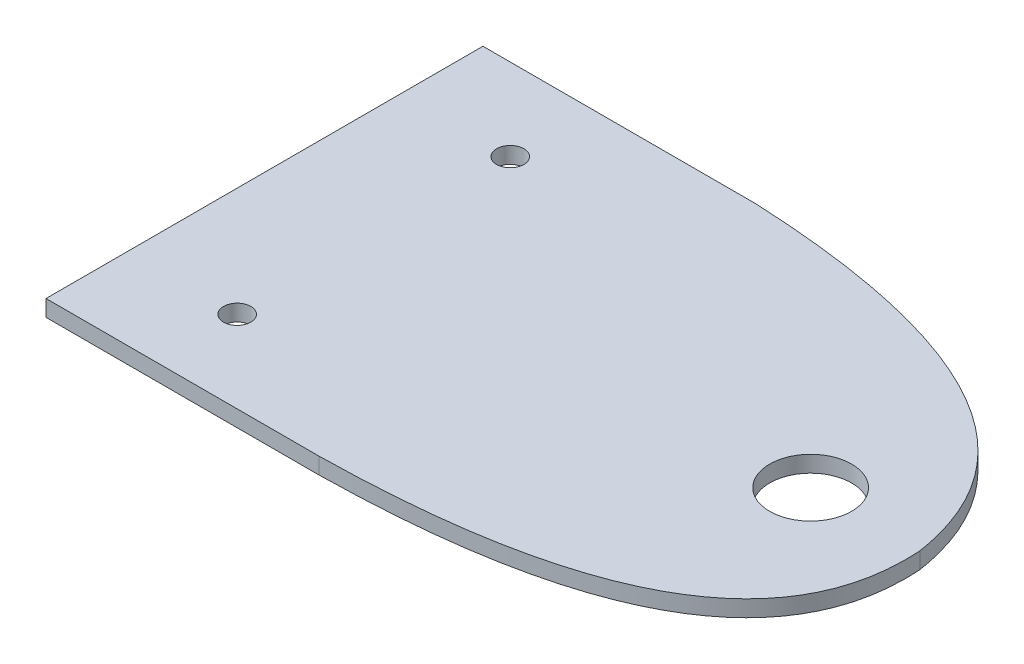
ISO-10303-21;
HEADER;
FILE_DESCRIPTION(('STEP AP214'),'2;1');
FILE_NAME('part.step','',(''),(''),'','','');
FILE_SCHEMA(('AUTOMOTIVE_DESIGN { 1 0 10303 214 1 1 1 1 }'));
ENDSEC;
DATA;
#1=APPLICATION_CONTEXT('core data for automotive mechanical design processes');
#2=APPLICATION_PROTOCOL_DEFINITION('international standard','automotive_design',2000,#1);
#3=PRODUCT_CONTEXT('',#1,'mechanical');
#4=PRODUCT('Part','Part','',(#3));
#5=PRODUCT_RELATED_PRODUCT_CATEGORY('part','',(#4));
#6=PRODUCT_DEFINITION_FORMATION('','',#4);
#7=PRODUCT_DEFINITION_CONTEXT('part definition',#1,'design');
#8=PRODUCT_DEFINITION('design','',#6,#7);
#9=PRODUCT_DEFINITION_SHAPE('','',#8);
#10=(LENGTH_UNIT() NAMED_UNIT(*) SI_UNIT(.MILLI.,.METRE.));
#11=(NAMED_UNIT(*) PLANE_ANGLE_UNIT() SI_UNIT($,.RADIAN.));
#12=(NAMED_UNIT(*) SI_UNIT($,.STERADIAN.) SOLID_ANGLE_UNIT());
#13=UNCERTAINTY_MEASURE_WITH_UNIT(LENGTH_MEASURE(1.E-05),#10,'distance_accuracy_value','');
#14=(GEOMETRIC_REPRESENTATION_CONTEXT(3) GLOBAL_UNCERTAINTY_ASSIGNED_CONTEXT((#13)) GLOBAL_UNIT_ASSIGNED_CONTEXT((#10,
#11,#12)) REPRESENTATION_CONTEXT('',''));
#15=CARTESIAN_POINT('',(0.,0.,0.));
#16=DIRECTION('',(0.,0.,1.));
#17=DIRECTION('',(1.,0.,0.));
#18=AXIS2_PLACEMENT_3D('',#15,#16,#17);
#19=CARTESIAN_POINT('',(0.,3.,40.));
#20=DIRECTION('',(0.,0.,-1.));
#21=DIRECTION('',(-1.,0.,0.));
#22=AXIS2_PLACEMENT_3D('',#19,#20,#21);
#23=PLANE('',#22);
#24=DIRECTION('',(1.,0.,0.));
#25=VECTOR('',#24,1.);
#26=CARTESIAN_POINT('',(0.,0.,40.));
#27=LINE('',#26,#25);
#28=CARTESIAN_POINT('',(-100.,0.,40.));
#29=VERTEX_POINT('',#28);
#30=CARTESIAN_POINT('',(-50.,0.,40.));
#31=VERTEX_POINT('',#30);
#32=EDGE_CURVE('E122',#29,#31,#27,.T.);
#33=ORIENTED_EDGE('',*,*,#32,.T.);
#34=DIRECTION('',(0.,-1.,0.));
#35=VECTOR('',#34,1.);
#36=CARTESIAN_POINT('',(-50.,3.,40.));
#37=LINE('',#36,#35);
#38=CARTESIAN_POINT('',(-50.,3.,40.));
#39=VERTEX_POINT('',#38);
#40=EDGE_CURVE('E11',#39,#31,#37,.T.);
#41=ORIENTED_EDGE('',*,*,#40,.F.);
#42=DIRECTION('',(1.,0.,0.));
#43=VECTOR('',#42,1.);
#44=CARTESIAN_POINT('',(0.,3.,40.));
#45=LINE('',#44,#43);
#46=CARTESIAN_POINT('',(-100.,3.,40.));
#47=VERTEX_POINT('',#46);
#48=EDGE_CURVE('E250',#47,#39,#45,.T.);
#49=ORIENTED_EDGE('',*,*,#48,.F.);
#50=DIRECTION('',(0.,-1.,0.));
#51=VECTOR('',#50,1.);
#52=CARTESIAN_POINT('',(-100.,3.,40.));
#53=LINE('',#52,#51);
#54=EDGE_CURVE('E52',#47,#29,#53,.T.);
#55=ORIENTED_EDGE('',*,*,#54,.T.);
#56=EDGE_LOOP('',(#33,#41,#49,#55));
#57=FACE_BOUND('',#56,.T.);
#58=ADVANCED_FACE('F35',(#57),#23,.F.);
#59=CARTESIAN_POINT('',(-50.,3.,40.));
#60=CARTESIAN_POINT('',(27.117327908936,3.,38.7786956464024));
#61=CARTESIAN_POINT('',(19.3908820577425,3.,-4.89833574009786));
#62=B_SPLINE_CURVE_WITH_KNOTS('',2,(#59,#60,#61),.UNSPECIFIED.,.F.,.F.,(3,3),(0.,1.),.UNSPECIFIED.);
#63=DIRECTION('',(0.,-1.,0.));
#64=VECTOR('',#63,1.);
#65=SURFACE_OF_LINEAR_EXTRUSION('',#62,#64);
#66=CARTESIAN_POINT('',(-50.,0.,40.));
#67=CARTESIAN_POINT('',(27.117327908936,0.,38.7786956464024));
#68=CARTESIAN_POINT('',(19.3908820577425,0.,-4.89833574009786));
#69=B_SPLINE_CURVE_WITH_KNOTS('',2,(#66,#67,#68),.UNSPECIFIED.,.F.,.F.,(3,3),(0.,1.),.UNSPECIFIED.);
#70=CARTESIAN_POINT('',(20.,0.,0.));
#71=VERTEX_POINT('',#70);
#72=EDGE_CURVE('E124',#31,#71,#69,.T.);
#73=ORIENTED_EDGE('',*,*,#72,.T.);
#74=DIRECTION('',(0.,-1.,0.));
#75=VECTOR('',#74,1.);
#76=CARTESIAN_POINT('',(20.,3.,0.));
#77=LINE('',#76,#75);
#78=CARTESIAN_POINT('',(20.,3.,0.));
#79=VERTEX_POINT('',#78);
#80=EDGE_CURVE('E44',#79,#71,#77,.T.);
#81=ORIENTED_EDGE('',*,*,#80,.F.);
#82=EDGE_CURVE('E81',#39,#79,#62,.T.);
#83=ORIENTED_EDGE('',*,*,#82,.F.);
#84=ORIENTED_EDGE('',*,*,#40,.T.);
#85=EDGE_LOOP('',(#73,#81,#83,#84));
#86=FACE_BOUND('',#85,.T.);
#87=ADVANCED_FACE('F145',(#86),#65,.F.);
#88=CARTESIAN_POINT('',(-50.,3.,-40.));
#89=CARTESIAN_POINT('',(14.3898708250912,3.,-37.0556043543383));
#90=CARTESIAN_POINT('',(20.,3.,0.));
#91=B_SPLINE_CURVE_WITH_KNOTS('',2,(#88,#89,#90),.UNSPECIFIED.,.F.,.F.,(3,3),(0.,
0.839710595003454),.UNSPECIFIED.);
#92=DIRECTION('',(0.,-1.,0.));
#93=VECTOR('',#92,1.);
#94=SURFACE_OF_LINEAR_EXTRUSION('',#91,#93);
#95=CARTESIAN_POINT('',(-50.,0.,-40.));
#96=CARTESIAN_POINT('',(14.3898708250912,0.,-37.0556043543383));
#97=CARTESIAN_POINT('',(20.,0.,0.));
#98=B_SPLINE_CURVE_WITH_KNOTS('',2,(#95,#96,#97),.UNSPECIFIED.,.F.,.F.,(3,3),(0.,
0.839710595003454),.UNSPECIFIED.);
#99=CARTESIAN_POINT('',(-50.,0.,-40.));
#100=VERTEX_POINT('',#99);
#101=EDGE_CURVE('E93',#100,#71,#98,.T.);
#102=ORIENTED_EDGE('',*,*,#101,.F.);
#103=DIRECTION('',(0.,-1.,0.));
#104=VECTOR('',#103,1.);
#105=CARTESIAN_POINT('',(-50.,3.,-40.));
#106=LINE('',#105,#104);
#107=CARTESIAN_POINT('',(-50.,3.,-40.));
#108=VERTEX_POINT('',#107);
#109=EDGE_CURVE('E88',#108,#100,#106,.T.);
#110=ORIENTED_EDGE('',*,*,#109,.F.);
#111=EDGE_CURVE('E91',#108,#79,#91,.T.);
#112=ORIENTED_EDGE('',*,*,#111,.T.);
#113=ORIENTED_EDGE('',*,*,#80,.T.);
#114=EDGE_LOOP('',(#102,#110,#112,#113));
#115=FACE_BOUND('',#114,.T.);
#116=ADVANCED_FACE('F90',(#115),#94,.T.);
#117=CARTESIAN_POINT('',(0.,3.,-40.));
#118=DIRECTION('',(0.,0.,-1.));
#119=DIRECTION('',(-1.,0.,0.));
#120=AXIS2_PLACEMENT_3D('',#117,#118,#119);
#121=PLANE('',#120);
#122=DIRECTION('',(1.,0.,0.));
#123=VECTOR('',#122,1.);
#124=CARTESIAN_POINT('',(0.,0.,-40.));
#125=LINE('',#124,#123);
#126=CARTESIAN_POINT('',(-100.,0.,-40.));
#127=VERTEX_POINT('',#126);
#128=EDGE_CURVE('E135',#127,#100,#125,.T.);
#129=ORIENTED_EDGE('',*,*,#128,.F.);
#130=DIRECTION('',(0.,-1.,0.));
#131=VECTOR('',#130,1.);
#132=CARTESIAN_POINT('',(-100.,3.,-40.));
#133=LINE('',#132,#131);
#134=CARTESIAN_POINT('',(-100.,3.,-40.));
#135=VERTEX_POINT('',#134);
#136=EDGE_CURVE('E69',#135,#127,#133,.T.);
#137=ORIENTED_EDGE('',*,*,#136,.F.);
#138=DIRECTION('',(1.,0.,0.));
#139=VECTOR('',#138,1.);
#140=CARTESIAN_POINT('',(0.,3.,-40.));
#141=LINE('',#140,#139);
#142=EDGE_CURVE('E102',#135,#108,#141,.T.);
#143=ORIENTED_EDGE('',*,*,#142,.T.);
#144=ORIENTED_EDGE('',*,*,#109,.T.);
#145=EDGE_LOOP('',(#129,#137,#143,#144));
#146=FACE_BOUND('',#145,.T.);
#147=ADVANCED_FACE('F104',(#146),#121,.T.);
#148=CARTESIAN_POINT('',(-80.,3.,25.));
#149=DIRECTION('',(0.,-1.,0.));
#150=DIRECTION('',(0.,0.,-1.));
#151=AXIS2_PLACEMENT_3D('',#148,#149,#150);
#152=CYLINDRICAL_SURFACE('',#151,2.50000000000001);
#153=CARTESIAN_POINT('',(-80.,3.,25.));
#154=DIRECTION('',(0.,1.,0.));
#155=DIRECTION('',(0.,0.,1.));
#156=AXIS2_PLACEMENT_3D('',#153,#154,#155);
#157=CIRCLE('',#156,2.50000000000001);
#158=CARTESIAN_POINT('',(-80.,3.,27.5));
#159=VERTEX_POINT('',#158);
#160=EDGE_CURVE('E247',#159,#159,#157,.T.);
#161=ORIENTED_EDGE('',*,*,#160,.T.);
#162=EDGE_LOOP('',(#161));
#163=FACE_BOUND('',#162,.T.);
#164=CARTESIAN_POINT('',(-80.,0.,25.));
#165=DIRECTION('',(0.,1.,0.));
#166=DIRECTION('',(0.,0.,1.));
#167=AXIS2_PLACEMENT_3D('',#164,#165,#166);
#168=CIRCLE('',#167,2.50000000000001);
#169=CARTESIAN_POINT('',(-80.,0.,27.5));
#170=VERTEX_POINT('',#169);
#171=EDGE_CURVE('E119',#170,#170,#168,.T.);
#172=ORIENTED_EDGE('',*,*,#171,.F.);
#173=EDGE_LOOP('',(#172));
#174=FACE_BOUND('',#173,.T.);
#175=ADVANCED_FACE('F170',(#163,#174),#152,.F.);
#176=CARTESIAN_POINT('',(-80.,3.,-25.));
#177=DIRECTION('',(0.,-1.,0.));
#178=DIRECTION('',(0.,0.,-1.));
#179=AXIS2_PLACEMENT_3D('',#176,#177,#178);
#180=CYLINDRICAL_SURFACE('',#179,2.5);
#181=CARTESIAN_POINT('',(-80.,3.,-25.));
#182=DIRECTION('',(0.,1.,0.));
#183=DIRECTION('',(0.,0.,1.));
#184=AXIS2_PLACEMENT_3D('',#181,#182,#183);
#185=CIRCLE('',#184,2.5);
#186=CARTESIAN_POINT('',(-80.,3.,-22.5));
#187=VERTEX_POINT('',#186);
#188=EDGE_CURVE('E180',#187,#187,#185,.T.);
#189=ORIENTED_EDGE('',*,*,#188,.T.);
#190=EDGE_LOOP('',(#189));
#191=FACE_BOUND('',#190,.T.);
#192=CARTESIAN_POINT('',(-80.,0.,-25.));
#193=DIRECTION('',(0.,1.,0.));
#194=DIRECTION('',(0.,0.,1.));
#195=AXIS2_PLACEMENT_3D('',#192,#193,#194);
#196=CIRCLE('',#195,2.5);
#197=CARTESIAN_POINT('',(-80.,0.,-22.5));
#198=VERTEX_POINT('',#197);
#199=EDGE_CURVE('E116',#198,#198,#196,.T.);
#200=ORIENTED_EDGE('',*,*,#199,.F.);
#201=EDGE_LOOP('',(#200));
#202=FACE_BOUND('',#201,.T.);
#203=ADVANCED_FACE('F158',(#191,#202),#180,.F.);
#204=CARTESIAN_POINT('',(0.,3.,0.));
#205=DIRECTION('',(0.,-1.,0.));
#206=DIRECTION('',(0.,0.,-1.));
#207=AXIS2_PLACEMENT_3D('',#204,#205,#206);
#208=CYLINDRICAL_SURFACE('',#207,7.5);
#209=CARTESIAN_POINT('',(0.,3.,0.));
#210=DIRECTION('',(0.,1.,0.));
#211=DIRECTION('',(0.,0.,1.));
#212=AXIS2_PLACEMENT_3D('',#209,#210,#211);
#213=CIRCLE('',#212,7.5);
#214=CARTESIAN_POINT('',(0.,3.,7.5));
#215=VERTEX_POINT('',#214);
#216=EDGE_CURVE('E143',#215,#215,#213,.T.);
#217=ORIENTED_EDGE('',*,*,#216,.T.);
#218=EDGE_LOOP('',(#217));
#219=FACE_BOUND('',#218,.T.);
#220=CARTESIAN_POINT('',(0.,0.,0.));
#221=DIRECTION('',(0.,1.,0.));
#222=DIRECTION('',(0.,0.,1.));
#223=AXIS2_PLACEMENT_3D('',#220,#221,#222);
#224=CIRCLE('',#223,7.5);
#225=CARTESIAN_POINT('',(0.,0.,7.5));
#226=VERTEX_POINT('',#225);
#227=EDGE_CURVE('E113',#226,#226,#224,.T.);
#228=ORIENTED_EDGE('',*,*,#227,.F.);
#229=EDGE_LOOP('',(#228));
#230=FACE_BOUND('',#229,.T.);
#231=ADVANCED_FACE('F37',(#219,#230),#208,.F.);
#232=CARTESIAN_POINT('',(-100.,3.,0.));
#233=DIRECTION('',(-1.,0.,0.));
#234=DIRECTION('',(0.,0.,1.));
#235=AXIS2_PLACEMENT_3D('',#232,#233,#234);
#236=PLANE('',#235);
#237=DIRECTION('',(0.,0.,-1.));
#238=VECTOR('',#237,1.);
#239=CARTESIAN_POINT('',(-100.,0.,0.));
#240=LINE('',#239,#238);
#241=EDGE_CURVE('E140',#29,#127,#240,.T.);
#242=ORIENTED_EDGE('',*,*,#241,.F.);
#243=ORIENTED_EDGE('',*,*,#54,.F.);
#244=DIRECTION('',(0.,0.,-1.));
#245=VECTOR('',#244,1.);
#246=CARTESIAN_POINT('',(-100.,3.,0.));
#247=LINE('',#246,#245);
#248=EDGE_CURVE('E105',#47,#135,#247,.T.);
#249=ORIENTED_EDGE('',*,*,#248,.T.);
#250=ORIENTED_EDGE('',*,*,#136,.T.);
#251=EDGE_LOOP('',(#242,#243,#249,#250));
#252=FACE_BOUND('',#251,.T.);
#253=ADVANCED_FACE('F149',(#252),#236,.T.);
#254=CARTESIAN_POINT('',(0.,3.,0.));
#255=DIRECTION('',(0.,1.,0.));
#256=DIRECTION('',(0.,0.,1.));
#257=AXIS2_PLACEMENT_3D('',#254,#255,#256);
#258=PLANE('',#257);
#259=ORIENTED_EDGE('',*,*,#216,.F.);
#260=EDGE_LOOP('',(#259));
#261=FACE_BOUND('',#260,.T.);
#262=ORIENTED_EDGE('',*,*,#188,.F.);
#263=EDGE_LOOP('',(#262));
#264=FACE_BOUND('',#263,.T.);
#265=ORIENTED_EDGE('',*,*,#160,.F.);
#266=EDGE_LOOP('',(#265));
#267=FACE_BOUND('',#266,.T.);
#268=ORIENTED_EDGE('',*,*,#48,.T.);
#269=ORIENTED_EDGE('',*,*,#82,.T.);
#270=ORIENTED_EDGE('',*,*,#111,.F.);
#271=ORIENTED_EDGE('',*,*,#142,.F.);
#272=ORIENTED_EDGE('',*,*,#248,.F.);
#273=EDGE_LOOP('',(#268,#269,#270,#271,#272));
#274=FACE_BOUND('',#273,.T.);
#275=ADVANCED_FACE('F100',(#261,#264,#267,#274),#258,.T.);
#276=CARTESIAN_POINT('',(0.,0.,0.));
#277=DIRECTION('',(0.,1.,0.));
#278=DIRECTION('',(0.,0.,1.));
#279=AXIS2_PLACEMENT_3D('',#276,#277,#278);
#280=PLANE('',#279);
#281=ORIENTED_EDGE('',*,*,#227,.T.);
#282=EDGE_LOOP('',(#281));
#283=FACE_BOUND('',#282,.T.);
#284=ORIENTED_EDGE('',*,*,#199,.T.);
#285=EDGE_LOOP('',(#284));
#286=FACE_BOUND('',#285,.T.);
#287=ORIENTED_EDGE('',*,*,#171,.T.);
#288=EDGE_LOOP('',(#287));
#289=FACE_BOUND('',#288,.T.);
#290=ORIENTED_EDGE('',*,*,#32,.F.);
#291=ORIENTED_EDGE('',*,*,#241,.T.);
#292=ORIENTED_EDGE('',*,*,#128,.T.);
#293=ORIENTED_EDGE('',*,*,#101,.T.);
#294=ORIENTED_EDGE('',*,*,#72,.F.);
#295=EDGE_LOOP('',(#290,#291,#292,#293,#294));
#296=FACE_BOUND('',#295,.T.);
#297=ADVANCED_FACE('F148',(#283,#286,#289,#296),#280,.F.);
#298=CLOSED_SHELL('',(#58,#87,#116,#147,#175,#203,#231,#253,#275,#297));
#299=MANIFOLD_SOLID_BREP('B2',#298);
#300=ADVANCED_BREP_SHAPE_REPRESENTATION('',(#18,#299),#14);
#301=SHAPE_DEFINITION_REPRESENTATION(#9,#300);
ENDSEC;
END-ISO-10303-21;
